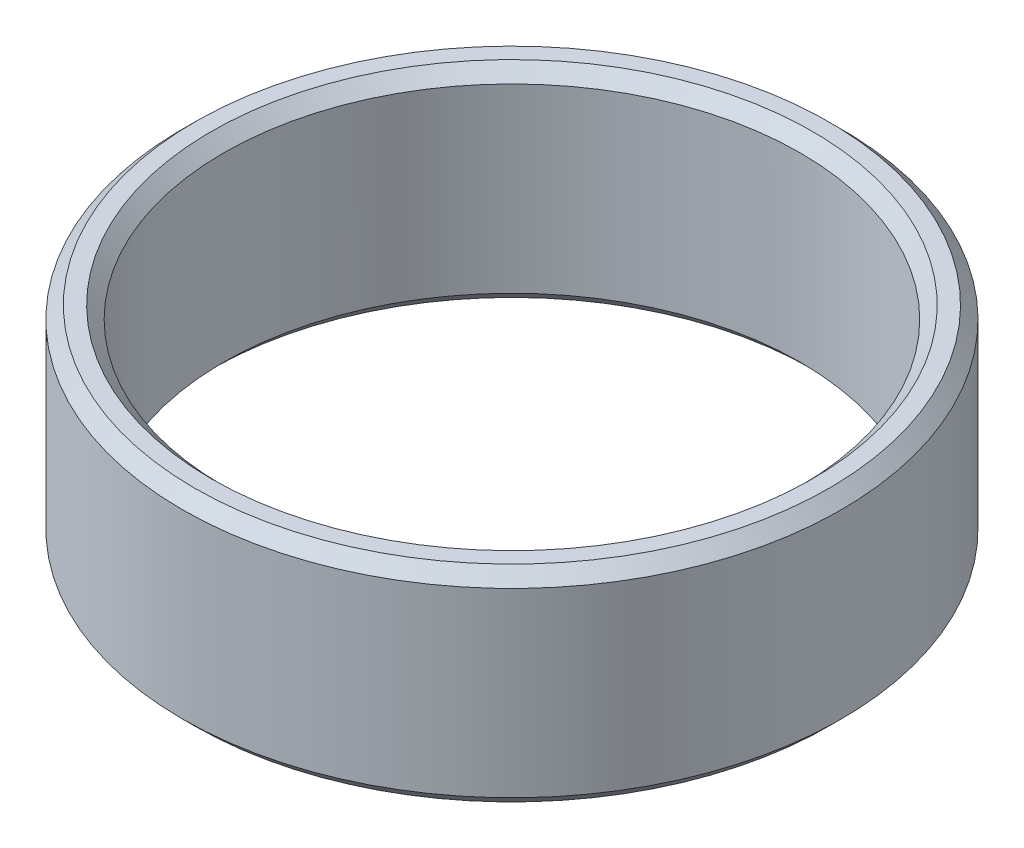
ISO-10303-21;
HEADER;
FILE_DESCRIPTION(('STEP AP214'),'2;1');
FILE_NAME('part.step','',(''),(''),'','','');
FILE_SCHEMA(('AUTOMOTIVE_DESIGN { 1 0 10303 214 1 1 1 1 }'));
ENDSEC;
DATA;
#1=APPLICATION_CONTEXT('core data for automotive mechanical design processes');
#2=APPLICATION_PROTOCOL_DEFINITION('international standard','automotive_design',2000,#1);
#3=PRODUCT_CONTEXT('',#1,'mechanical');
#4=PRODUCT('Part','Part','',(#3));
#5=PRODUCT_RELATED_PRODUCT_CATEGORY('part','',(#4));
#6=PRODUCT_DEFINITION_FORMATION('','',#4);
#7=PRODUCT_DEFINITION_CONTEXT('part definition',#1,'design');
#8=PRODUCT_DEFINITION('design','',#6,#7);
#9=PRODUCT_DEFINITION_SHAPE('','',#8);
#10=(LENGTH_UNIT() NAMED_UNIT(*) SI_UNIT(.MILLI.,.METRE.));
#11=(NAMED_UNIT(*) PLANE_ANGLE_UNIT() SI_UNIT($,.RADIAN.));
#12=(NAMED_UNIT(*) SI_UNIT($,.STERADIAN.) SOLID_ANGLE_UNIT());
#13=UNCERTAINTY_MEASURE_WITH_UNIT(LENGTH_MEASURE(1.E-05),#10,'distance_accuracy_value','');
#14=(GEOMETRIC_REPRESENTATION_CONTEXT(3) GLOBAL_UNCERTAINTY_ASSIGNED_CONTEXT((#13)) GLOBAL_UNIT_ASSIGNED_CONTEXT((#10,
#11,#12)) REPRESENTATION_CONTEXT('',''));
#15=CARTESIAN_POINT('',(0.,0.,0.));
#16=DIRECTION('',(0.,0.,1.));
#17=DIRECTION('',(1.,0.,0.));
#18=AXIS2_PLACEMENT_3D('',#15,#16,#17);
#19=CARTESIAN_POINT('',(0.,5.,0.));
#20=DIRECTION('',(0.,1.,0.));
#21=DIRECTION('',(0.,0.,1.));
#22=AXIS2_PLACEMENT_3D('',#19,#20,#21);
#23=PLANE('',#22);
#24=CARTESIAN_POINT('',(0.,5.,0.));
#25=DIRECTION('',(0.,1.,0.));
#26=DIRECTION('',(0.,0.,1.));
#27=AXIS2_PLACEMENT_3D('',#24,#25,#26);
#28=CIRCLE('',#27,7.3);
#29=CARTESIAN_POINT('',(0.,5.,7.3));
#30=VERTEX_POINT('',#29);
#31=EDGE_CURVE('E41',#30,#30,#28,.F.);
#32=ORIENTED_EDGE('',*,*,#31,.T.);
#33=EDGE_LOOP('',(#32));
#34=FACE_BOUND('',#33,.T.);
#35=CARTESIAN_POINT('',(0.,5.,0.));
#36=DIRECTION('',(0.,1.,0.));
#37=DIRECTION('',(0.,0.,1.));
#38=AXIS2_PLACEMENT_3D('',#35,#36,#37);
#39=CIRCLE('',#38,7.70000000000001);
#40=CARTESIAN_POINT('',(0.,5.,7.70000000000001));
#41=VERTEX_POINT('',#40);
#42=EDGE_CURVE('E45',#41,#41,#39,.T.);
#43=ORIENTED_EDGE('',*,*,#42,.T.);
#44=EDGE_LOOP('',(#43));
#45=FACE_BOUND('',#44,.T.);
#46=ADVANCED_FACE('F30',(#34,#45),#23,.T.);
#47=CARTESIAN_POINT('',(0.,0.,0.));
#48=DIRECTION('',(0.,1.,0.));
#49=DIRECTION('',(0.,0.,1.));
#50=AXIS2_PLACEMENT_3D('',#47,#48,#49);
#51=PLANE('',#50);
#52=CARTESIAN_POINT('',(0.,0.,0.));
#53=DIRECTION('',(0.,1.,0.));
#54=DIRECTION('',(0.,0.,1.));
#55=AXIS2_PLACEMENT_3D('',#52,#53,#54);
#56=CIRCLE('',#55,7.3);
#57=CARTESIAN_POINT('',(0.,0.,-7.3));
#58=VERTEX_POINT('',#57);
#59=EDGE_CURVE('E56',#58,#58,#56,.T.);
#60=ORIENTED_EDGE('',*,*,#59,.T.);
#61=EDGE_LOOP('',(#60));
#62=FACE_BOUND('',#61,.T.);
#63=CARTESIAN_POINT('',(0.,0.,0.));
#64=DIRECTION('',(0.,1.,0.));
#65=DIRECTION('',(0.,0.,1.));
#66=AXIS2_PLACEMENT_3D('',#63,#64,#65);
#67=CIRCLE('',#66,7.7);
#68=CARTESIAN_POINT('',(0.,0.,7.7));
#69=VERTEX_POINT('',#68);
#70=EDGE_CURVE('E59',#69,#69,#67,.F.);
#71=ORIENTED_EDGE('',*,*,#70,.T.);
#72=EDGE_LOOP('',(#71));
#73=FACE_BOUND('',#72,.T.);
#74=ADVANCED_FACE('F63',(#62,#73),#51,.F.);
#75=CARTESIAN_POINT('',(0.,5.,0.));
#76=DIRECTION('',(0.,-1.,0.));
#77=DIRECTION('',(0.,0.,-1.));
#78=AXIS2_PLACEMENT_3D('',#75,#76,#77);
#79=CYLINDRICAL_SURFACE('',#78,8.);
#80=CARTESIAN_POINT('',(0.,0.300000000000002,0.));
#81=DIRECTION('',(0.,1.,0.));
#82=DIRECTION('',(0.,0.,1.));
#83=AXIS2_PLACEMENT_3D('',#80,#81,#82);
#84=CIRCLE('',#83,8.);
#85=CARTESIAN_POINT('',(0.,0.300000000000002,8.));
#86=VERTEX_POINT('',#85);
#87=EDGE_CURVE('E10',#86,#86,#84,.T.);
#88=ORIENTED_EDGE('',*,*,#87,.T.);
#89=EDGE_LOOP('',(#88));
#90=FACE_BOUND('',#89,.T.);
#91=CARTESIAN_POINT('',(0.,4.7,0.));
#92=DIRECTION('',(0.,1.,0.));
#93=DIRECTION('',(0.,0.,1.));
#94=AXIS2_PLACEMENT_3D('',#91,#92,#93);
#95=CIRCLE('',#94,8.);
#96=CARTESIAN_POINT('',(0.,4.7,8.));
#97=VERTEX_POINT('',#96);
#98=EDGE_CURVE('E37',#97,#97,#95,.F.);
#99=ORIENTED_EDGE('',*,*,#98,.T.);
#100=EDGE_LOOP('',(#99));
#101=FACE_BOUND('',#100,.T.);
#102=ADVANCED_FACE('F83',(#90,#101),#79,.T.);
#103=CARTESIAN_POINT('',(0.,5.,0.));
#104=DIRECTION('',(0.,-1.,0.));
#105=DIRECTION('',(0.,0.,-1.));
#106=AXIS2_PLACEMENT_3D('',#103,#104,#105);
#107=CYLINDRICAL_SURFACE('',#106,7.);
#108=CARTESIAN_POINT('',(0.,0.300000000000005,0.));
#109=DIRECTION('',(0.,1.,0.));
#110=DIRECTION('',(0.,0.,1.));
#111=AXIS2_PLACEMENT_3D('',#108,#109,#110);
#112=CIRCLE('',#111,7.);
#113=CARTESIAN_POINT('',(0.,0.300000000000005,-7.));
#114=VERTEX_POINT('',#113);
#115=EDGE_CURVE('E50',#114,#114,#112,.F.);
#116=ORIENTED_EDGE('',*,*,#115,.T.);
#117=EDGE_LOOP('',(#116));
#118=FACE_BOUND('',#117,.T.);
#119=CARTESIAN_POINT('',(0.,4.7,0.));
#120=DIRECTION('',(0.,1.,0.));
#121=DIRECTION('',(0.,0.,1.));
#122=AXIS2_PLACEMENT_3D('',#119,#120,#121);
#123=CIRCLE('',#122,7.);
#124=CARTESIAN_POINT('',(0.,4.7,7.));
#125=VERTEX_POINT('',#124);
#126=EDGE_CURVE('E53',#125,#125,#123,.T.);
#127=ORIENTED_EDGE('',*,*,#126,.T.);
#128=EDGE_LOOP('',(#127));
#129=FACE_BOUND('',#128,.T.);
#130=ADVANCED_FACE('F88',(#118,#129),#107,.F.);
#131=CARTESIAN_POINT('',(0.,0.,0.));
#132=DIRECTION('',(0.,-1.,0.));
#133=DIRECTION('',(0.,0.,-1.));
#134=AXIS2_PLACEMENT_3D('',#131,#132,#133);
#135=CONICAL_SURFACE('',#134,7.3,0.785398163397444);
#136=CARTESIAN_POINT('',(0.,0.300000000000005,-7.));
#137=CARTESIAN_POINT('',(0.,0.296875000000005,-7.003125));
#138=CARTESIAN_POINT('',(0.,0.293750000000005,-7.00625));
#139=CARTESIAN_POINT('',(0.,0.287500000000005,-7.0125));
#140=CARTESIAN_POINT('',(0.,0.284375000000005,-7.015625));
#141=CARTESIAN_POINT('',(0.,0.278125000000005,-7.021875));
#142=CARTESIAN_POINT('',(0.,0.275000000000005,-7.025));
#143=CARTESIAN_POINT('',(0.,0.268750000000004,-7.03125));
#144=CARTESIAN_POINT('',(0.,0.265625000000004,-7.034375));
#145=CARTESIAN_POINT('',(0.,0.259375000000004,-7.040625));
#146=CARTESIAN_POINT('',(0.,0.256250000000004,-7.04375));
#147=CARTESIAN_POINT('',(0.,0.250000000000004,-7.05));
#148=CARTESIAN_POINT('',(0.,0.246875000000004,-7.053125));
#149=CARTESIAN_POINT('',(0.,0.240625000000004,-7.059375));
#150=CARTESIAN_POINT('',(0.,0.237500000000004,-7.0625));
#151=CARTESIAN_POINT('',(0.,0.231250000000004,-7.06875));
#152=CARTESIAN_POINT('',(0.,0.228125000000004,-7.071875));
#153=CARTESIAN_POINT('',(0.,0.221875000000004,-7.078125));
#154=CARTESIAN_POINT('',(0.,0.218750000000004,-7.08125));
#155=CARTESIAN_POINT('',(0.,0.212500000000004,-7.0875));
#156=CARTESIAN_POINT('',(0.,0.209375000000004,-7.090625));
#157=CARTESIAN_POINT('',(0.,0.203125000000003,-7.096875));
#158=CARTESIAN_POINT('',(0.,0.200000000000003,-7.1));
#159=CARTESIAN_POINT('',(0.,0.193750000000003,-7.10625));
#160=CARTESIAN_POINT('',(0.,0.190625000000003,-7.109375));
#161=CARTESIAN_POINT('',(0.,0.184375000000003,-7.115625));
#162=CARTESIAN_POINT('',(0.,0.181250000000003,-7.11875));
#163=CARTESIAN_POINT('',(0.,0.175000000000003,-7.125));
#164=CARTESIAN_POINT('',(0.,0.171875000000003,-7.128125));
#165=CARTESIAN_POINT('',(0.,0.165625000000003,-7.134375));
#166=CARTESIAN_POINT('',(0.,0.162500000000003,-7.1375));
#167=CARTESIAN_POINT('',(0.,0.156250000000003,-7.14375));
#168=CARTESIAN_POINT('',(0.,0.153125000000003,-7.146875));
#169=CARTESIAN_POINT('',(0.,0.146875000000003,-7.153125));
#170=CARTESIAN_POINT('',(0.,0.143750000000002,-7.15625));
#171=CARTESIAN_POINT('',(0.,0.137500000000002,-7.1625));
#172=CARTESIAN_POINT('',(0.,0.134375000000002,-7.165625));
#173=CARTESIAN_POINT('',(0.,0.128125000000002,-7.171875));
#174=CARTESIAN_POINT('',(0.,0.125000000000002,-7.175));
#175=CARTESIAN_POINT('',(0.,0.118750000000002,-7.18125));
#176=CARTESIAN_POINT('',(0.,0.115625000000002,-7.184375));
#177=CARTESIAN_POINT('',(0.,0.109375000000002,-7.190625));
#178=CARTESIAN_POINT('',(0.,0.106250000000002,-7.19375));
#179=CARTESIAN_POINT('',(0.,0.100000000000002,-7.2));
#180=CARTESIAN_POINT('',(0.,0.0968750000000017,-7.203125));
#181=CARTESIAN_POINT('',(0.,0.0906250000000015,-7.209375));
#182=CARTESIAN_POINT('',(0.,0.0875000000000014,-7.2125));
#183=CARTESIAN_POINT('',(0.,0.0812500000000013,-7.21875));
#184=CARTESIAN_POINT('',(0.,0.0781250000000014,-7.221875));
#185=CARTESIAN_POINT('',(0.,0.0718750000000013,-7.228125));
#186=CARTESIAN_POINT('',(0.,0.0687500000000012,-7.23125));
#187=CARTESIAN_POINT('',(0.,0.062500000000001,-7.2375));
#188=CARTESIAN_POINT('',(0.,0.0593750000000009,-7.240625));
#189=CARTESIAN_POINT('',(0.,0.0531250000000009,-7.246875));
#190=CARTESIAN_POINT('',(0.,0.0500000000000009,-7.25));
#191=CARTESIAN_POINT('',(0.,0.0437500000000008,-7.25625));
#192=CARTESIAN_POINT('',(0.,0.0406250000000007,-7.259375));
#193=CARTESIAN_POINT('',(0.,0.0343750000000006,-7.265625));
#194=CARTESIAN_POINT('',(0.,0.0312500000000005,-7.26875));
#195=CARTESIAN_POINT('',(0.,0.0250000000000004,-7.275));
#196=CARTESIAN_POINT('',(0.,0.0218750000000003,-7.278125));
#197=CARTESIAN_POINT('',(0.,0.0156250000000002,-7.284375));
#198=CARTESIAN_POINT('',(0.,0.0125000000000002,-7.2875));
#199=CARTESIAN_POINT('',(0.,0.00625000000000024,-7.29375));
#200=CARTESIAN_POINT('',(0.,0.00312500000000026,-7.296875));
#201=CARTESIAN_POINT('',(0.,0.,-7.3));
#202=B_SPLINE_CURVE_WITH_KNOTS('',3,(#136,#137,#138,#139,#140,#141,#142,#143,#144,#145,#146,
#147,#148,#149,#150,#151,#152,#153,#154,#155,#156,#157,#158,#159,#160,#161,#162,#163,#164,#165,
#166,#167,#168,#169,#170,#171,#172,#173,#174,#175,#176,#177,#178,#179,#180,#181,#182,#183,#184,
#185,#186,#187,#188,#189,#190,#191,#192,#193,#194,#195,#196,#197,#198,#199,#200,#201),
.UNSPECIFIED.,.F.,.F.,(4,2,2,2,2,2,2,2,2,2,2,2,2,2,2,2,2,2,2,2,2,2,2,2,2,2,2,2,2,2,2,2,4),(0.,
0.0132582521472478,0.0265165042944961,0.0397747564417439,0.0530330085889917,0.0662912607362394,
0.0795495128834878,0.0928077650307355,0.106066017177983,0.119324269325232,0.132582521472479,
0.145840773619727,0.159099025766975,0.172357277914223,0.185615530061471,0.198873782208719,
0.212132034355967,0.225390286503215,0.238648538650463,0.251906790797711,0.265165042944959,
0.278423295092207,0.291681547239454,0.304939799386702,0.318198051533951,0.331456303681198,
0.344714555828446,0.357972807975695,0.371231060122942,0.38448931227019,0.397747564417438,
0.411005816564686,0.424264068711934),.UNSPECIFIED.);
#203=EDGE_CURVE('BSEAM74',#114,#58,#202,.T.);
#204=ORIENTED_EDGE('',*,*,#115,.F.);
#205=ORIENTED_EDGE('',*,*,#59,.F.);
#206=ORIENTED_EDGE('',*,*,#203,.T.);
#207=ORIENTED_EDGE('',*,*,#203,.F.);
#208=EDGE_LOOP('',(#204,#206,#205,#207));
#209=FACE_BOUND('',#208,.T.);
#210=ADVANCED_FACE('F74',(#209),#135,.F.);
#211=CARTESIAN_POINT('',(0.,4.7,0.));
#212=DIRECTION('',(0.,1.,0.));
#213=DIRECTION('',(0.,0.,1.));
#214=AXIS2_PLACEMENT_3D('',#211,#212,#213);
#215=CONICAL_SURFACE('',#214,7.,0.785398163397453);
#216=ORIENTED_EDGE('',*,*,#31,.F.);
#217=EDGE_LOOP('',(#216));
#218=FACE_BOUND('',#217,.T.);
#219=ORIENTED_EDGE('',*,*,#126,.F.);
#220=EDGE_LOOP('',(#219));
#221=FACE_BOUND('',#220,.T.);
#222=ADVANCED_FACE('F68',(#218,#221),#215,.F.);
#223=CARTESIAN_POINT('',(0.,0.300000000000002,0.));
#224=DIRECTION('',(0.,1.,0.));
#225=DIRECTION('',(0.,0.,1.));
#226=AXIS2_PLACEMENT_3D('',#223,#224,#225);
#227=CONICAL_SURFACE('',#226,8.,0.785398163397445);
#228=ORIENTED_EDGE('',*,*,#70,.F.);
#229=EDGE_LOOP('',(#228));
#230=FACE_BOUND('',#229,.T.);
#231=ORIENTED_EDGE('',*,*,#87,.F.);
#232=EDGE_LOOP('',(#231));
#233=FACE_BOUND('',#232,.T.);
#234=ADVANCED_FACE('F65',(#230,#233),#227,.T.);
#235=CARTESIAN_POINT('',(0.,5.,0.));
#236=DIRECTION('',(0.,-1.,0.));
#237=DIRECTION('',(0.,0.,-1.));
#238=AXIS2_PLACEMENT_3D('',#235,#236,#237);
#239=CONICAL_SURFACE('',#238,7.70000000000001,0.78539816339744);
#240=ORIENTED_EDGE('',*,*,#98,.F.);
#241=EDGE_LOOP('',(#240));
#242=FACE_BOUND('',#241,.T.);
#243=ORIENTED_EDGE('',*,*,#42,.F.);
#244=EDGE_LOOP('',(#243));
#245=FACE_BOUND('',#244,.T.);
#246=ADVANCED_FACE('F32',(#242,#245),#239,.T.);
#247=CLOSED_SHELL('',(#46,#74,#102,#130,#210,#222,#234,#246));
#248=MANIFOLD_SOLID_BREP('B2',#247);
#249=ADVANCED_BREP_SHAPE_REPRESENTATION('',(#18,#248),#14);
#250=SHAPE_DEFINITION_REPRESENTATION(#9,#249);
ENDSEC;
END-ISO-10303-21;
